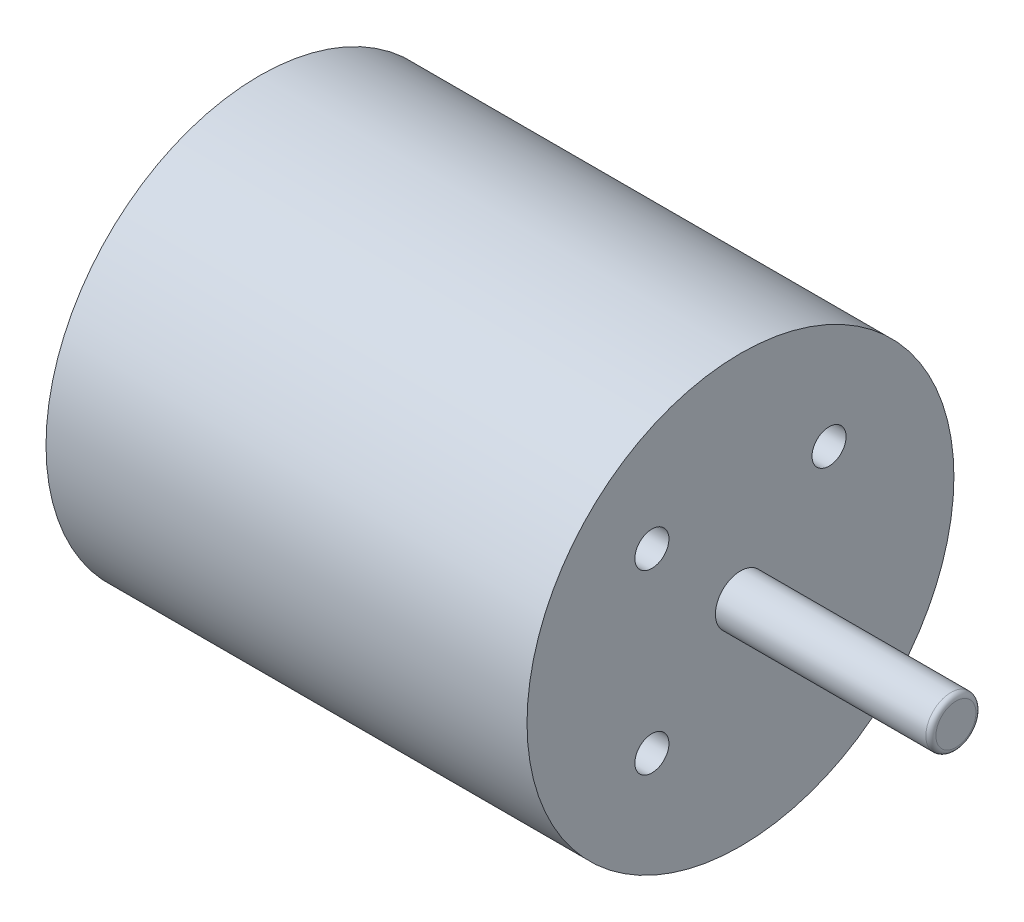
ISO-10303-21;
HEADER;
FILE_DESCRIPTION(('STEP AP214'),'2;1');
FILE_NAME('part.step','',(''),(''),'','','');
FILE_SCHEMA(('AUTOMOTIVE_DESIGN { 1 0 10303 214 1 1 1 1 }'));
ENDSEC;
DATA;
#1=APPLICATION_CONTEXT('core data for automotive mechanical design processes');
#2=APPLICATION_PROTOCOL_DEFINITION('international standard','automotive_design',2000,#1);
#3=PRODUCT_CONTEXT('',#1,'mechanical');
#4=PRODUCT('Part','Part','',(#3));
#5=PRODUCT_RELATED_PRODUCT_CATEGORY('part','',(#4));
#6=PRODUCT_DEFINITION_FORMATION('','',#4);
#7=PRODUCT_DEFINITION_CONTEXT('part definition',#1,'design');
#8=PRODUCT_DEFINITION('design','',#6,#7);
#9=PRODUCT_DEFINITION_SHAPE('','',#8);
#10=(LENGTH_UNIT() NAMED_UNIT(*) SI_UNIT(.MILLI.,.METRE.));
#11=(NAMED_UNIT(*) PLANE_ANGLE_UNIT() SI_UNIT($,.RADIAN.));
#12=(NAMED_UNIT(*) SI_UNIT($,.STERADIAN.) SOLID_ANGLE_UNIT());
#13=UNCERTAINTY_MEASURE_WITH_UNIT(LENGTH_MEASURE(1.E-05),#10,'distance_accuracy_value','');
#14=(GEOMETRIC_REPRESENTATION_CONTEXT(3) GLOBAL_UNCERTAINTY_ASSIGNED_CONTEXT((#13)) GLOBAL_UNIT_ASSIGNED_CONTEXT((#10,
#11,#12)) REPRESENTATION_CONTEXT('',''));
#15=CARTESIAN_POINT('',(0.,0.,0.));
#16=DIRECTION('',(0.,0.,1.));
#17=DIRECTION('',(1.,0.,0.));
#18=AXIS2_PLACEMENT_3D('',#15,#16,#17);
#19=CARTESIAN_POINT('',(36.5,0.,0.));
#20=DIRECTION('',(1.,0.,0.));
#21=DIRECTION('',(0.,0.,-1.));
#22=AXIS2_PLACEMENT_3D('',#19,#20,#21);
#23=CYLINDRICAL_SURFACE('',#22,2.501);
#24=CARTESIAN_POINT('',(-32.5,0.,0.));
#25=DIRECTION('',(1.,0.,0.));
#26=DIRECTION('',(0.,0.,-1.));
#27=AXIS2_PLACEMENT_3D('',#24,#25,#26);
#28=CIRCLE('',#27,2.50100000000001);
#29=CARTESIAN_POINT('',(-32.5,0.,-2.50100000000001));
#30=VERTEX_POINT('',#29);
#31=EDGE_CURVE('E12',#30,#30,#28,.T.);
#32=ORIENTED_EDGE('',*,*,#31,.F.);
#33=EDGE_LOOP('',(#32));
#34=FACE_BOUND('',#33,.T.);
#35=CARTESIAN_POINT('',(15.5,0.,0.));
#36=DIRECTION('',(1.,0.,0.));
#37=DIRECTION('',(0.,0.,-1.));
#38=AXIS2_PLACEMENT_3D('',#35,#36,#37);
#39=CIRCLE('',#38,2.501);
#40=CARTESIAN_POINT('',(15.5,0.,-2.501));
#41=VERTEX_POINT('',#40);
#42=EDGE_CURVE('E154',#41,#41,#39,.T.);
#43=ORIENTED_EDGE('',*,*,#42,.T.);
#44=EDGE_LOOP('',(#43));
#45=FACE_BOUND('',#44,.T.);
#46=ADVANCED_FACE('F48',(#34,#45),#23,.F.);
#47=CARTESIAN_POINT('',(-32.5,0.,2.50100000000001));
#48=DIRECTION('',(1.,0.,0.));
#49=DIRECTION('',(0.,0.,-1.));
#50=AXIS2_PLACEMENT_3D('',#47,#48,#49);
#51=PLANE('',#50);
#52=CARTESIAN_POINT('',(-32.5,7.07106781186543,-7.07106781186552));
#53=DIRECTION('',(-1.,0.,0.));
#54=DIRECTION('',(0.,0.,1.));
#55=AXIS2_PLACEMENT_3D('',#52,#53,#54);
#56=CIRCLE('',#55,1.7);
#57=CARTESIAN_POINT('',(-32.5,7.07106781186543,-5.37106781186552));
#58=VERTEX_POINT('',#57);
#59=EDGE_CURVE('E93',#58,#58,#56,.T.);
#60=ORIENTED_EDGE('',*,*,#59,.F.);
#61=EDGE_LOOP('',(#60));
#62=FACE_BOUND('',#61,.T.);
#63=CARTESIAN_POINT('',(-32.5,-7.07106781186543,-7.07106781186552));
#64=DIRECTION('',(-1.,0.,0.));
#65=DIRECTION('',(0.,0.,1.));
#66=AXIS2_PLACEMENT_3D('',#63,#64,#65);
#67=CIRCLE('',#66,1.7);
#68=CARTESIAN_POINT('',(-32.5,-7.07106781186543,-5.37106781186552));
#69=VERTEX_POINT('',#68);
#70=EDGE_CURVE('E92',#69,#69,#67,.T.);
#71=ORIENTED_EDGE('',*,*,#70,.F.);
#72=EDGE_LOOP('',(#71));
#73=FACE_BOUND('',#72,.T.);
#74=CARTESIAN_POINT('',(-32.5,-7.07106781186543,7.07106781186552));
#75=DIRECTION('',(-1.,0.,0.));
#76=DIRECTION('',(0.,0.,1.));
#77=AXIS2_PLACEMENT_3D('',#74,#75,#76);
#78=CIRCLE('',#77,1.7);
#79=CARTESIAN_POINT('',(-32.5,-7.07106781186543,8.77106781186552));
#80=VERTEX_POINT('',#79);
#81=EDGE_CURVE('E106',#80,#80,#78,.T.);
#82=ORIENTED_EDGE('',*,*,#81,.F.);
#83=EDGE_LOOP('',(#82));
#84=FACE_BOUND('',#83,.T.);
#85=CARTESIAN_POINT('',(-32.5,7.07106781186543,7.07106781186552));
#86=DIRECTION('',(-1.,0.,0.));
#87=DIRECTION('',(0.,0.,1.));
#88=AXIS2_PLACEMENT_3D('',#85,#86,#87);
#89=CIRCLE('',#88,1.7);
#90=CARTESIAN_POINT('',(-32.5,7.07106781186543,8.77106781186552));
#91=VERTEX_POINT('',#90);
#92=EDGE_CURVE('E114',#91,#91,#89,.T.);
#93=ORIENTED_EDGE('',*,*,#92,.F.);
#94=EDGE_LOOP('',(#93));
#95=FACE_BOUND('',#94,.T.);
#96=CARTESIAN_POINT('',(-32.5,0.,0.));
#97=DIRECTION('',(1.,0.,0.));
#98=DIRECTION('',(0.,0.,-1.));
#99=AXIS2_PLACEMENT_3D('',#96,#97,#98);
#100=CIRCLE('',#99,21.3);
#101=CARTESIAN_POINT('',(-32.5,0.,-21.3));
#102=VERTEX_POINT('',#101);
#103=EDGE_CURVE('E56',#102,#102,#100,.T.);
#104=ORIENTED_EDGE('',*,*,#103,.F.);
#105=EDGE_LOOP('',(#104));
#106=FACE_BOUND('',#105,.T.);
#107=ORIENTED_EDGE('',*,*,#31,.T.);
#108=EDGE_LOOP('',(#107));
#109=FACE_BOUND('',#108,.T.);
#110=ADVANCED_FACE('F167',(#62,#73,#84,#95,#106,#109),#51,.F.);
#111=CARTESIAN_POINT('',(36.5,0.,0.));
#112=DIRECTION('',(1.,0.,0.));
#113=DIRECTION('',(0.,0.,-1.));
#114=AXIS2_PLACEMENT_3D('',#111,#112,#113);
#115=CYLINDRICAL_SURFACE('',#114,21.3);
#116=CARTESIAN_POINT('',(15.5,0.,0.));
#117=DIRECTION('',(1.,0.,0.));
#118=DIRECTION('',(0.,0.,-1.));
#119=AXIS2_PLACEMENT_3D('',#116,#117,#118);
#120=CIRCLE('',#119,21.3);
#121=CARTESIAN_POINT('',(15.5,0.,-21.3));
#122=VERTEX_POINT('',#121);
#123=EDGE_CURVE('E158',#122,#122,#120,.T.);
#124=ORIENTED_EDGE('',*,*,#123,.F.);
#125=EDGE_LOOP('',(#124));
#126=FACE_BOUND('',#125,.T.);
#127=ORIENTED_EDGE('',*,*,#103,.T.);
#128=EDGE_LOOP('',(#127));
#129=FACE_BOUND('',#128,.T.);
#130=ADVANCED_FACE('F165',(#126,#129),#115,.T.);
#131=CARTESIAN_POINT('',(15.5,0.,21.3));
#132=DIRECTION('',(-1.,0.,0.));
#133=DIRECTION('',(0.,0.,1.));
#134=AXIS2_PLACEMENT_3D('',#131,#132,#133);
#135=PLANE('',#134);
#136=CARTESIAN_POINT('',(15.5,8.83883476483179,8.83883476483189));
#137=DIRECTION('',(1.,0.,0.));
#138=DIRECTION('',(0.,0.,-1.));
#139=AXIS2_PLACEMENT_3D('',#136,#137,#138);
#140=CIRCLE('',#139,1.7);
#141=CARTESIAN_POINT('',(15.5,8.83883476483179,7.13883476483189));
#142=VERTEX_POINT('',#141);
#143=EDGE_CURVE('E122',#142,#142,#140,.T.);
#144=ORIENTED_EDGE('',*,*,#143,.F.);
#145=EDGE_LOOP('',(#144));
#146=FACE_BOUND('',#145,.T.);
#147=CARTESIAN_POINT('',(15.5,8.83883476483179,-8.83883476483189));
#148=DIRECTION('',(1.,0.,0.));
#149=DIRECTION('',(0.,0.,-1.));
#150=AXIS2_PLACEMENT_3D('',#147,#148,#149);
#151=CIRCLE('',#150,1.7);
#152=CARTESIAN_POINT('',(15.5,8.83883476483179,-10.5388347648319));
#153=VERTEX_POINT('',#152);
#154=EDGE_CURVE('E130',#153,#153,#151,.T.);
#155=ORIENTED_EDGE('',*,*,#154,.F.);
#156=EDGE_LOOP('',(#155));
#157=FACE_BOUND('',#156,.T.);
#158=CARTESIAN_POINT('',(15.5,-8.83883476483179,-8.83883476483189));
#159=DIRECTION('',(1.,0.,0.));
#160=DIRECTION('',(0.,0.,-1.));
#161=AXIS2_PLACEMENT_3D('',#158,#159,#160);
#162=CIRCLE('',#161,1.7);
#163=CARTESIAN_POINT('',(15.5,-8.83883476483179,-10.5388347648319));
#164=VERTEX_POINT('',#163);
#165=EDGE_CURVE('E138',#164,#164,#162,.T.);
#166=ORIENTED_EDGE('',*,*,#165,.F.);
#167=EDGE_LOOP('',(#166));
#168=FACE_BOUND('',#167,.T.);
#169=CARTESIAN_POINT('',(15.5,-8.83883476483179,8.83883476483189));
#170=DIRECTION('',(1.,0.,0.));
#171=DIRECTION('',(0.,0.,-1.));
#172=AXIS2_PLACEMENT_3D('',#169,#170,#171);
#173=CIRCLE('',#172,1.7);
#174=CARTESIAN_POINT('',(15.5,-8.83883476483179,7.13883476483189));
#175=VERTEX_POINT('',#174);
#176=EDGE_CURVE('E146',#175,#175,#173,.T.);
#177=ORIENTED_EDGE('',*,*,#176,.F.);
#178=EDGE_LOOP('',(#177));
#179=FACE_BOUND('',#178,.T.);
#180=ORIENTED_EDGE('',*,*,#42,.F.);
#181=EDGE_LOOP('',(#180));
#182=FACE_BOUND('',#181,.T.);
#183=ORIENTED_EDGE('',*,*,#123,.T.);
#184=EDGE_LOOP('',(#183));
#185=FACE_BOUND('',#184,.T.);
#186=ADVANCED_FACE('F177',(#146,#157,#168,#179,#182,#185),#135,.F.);
#187=CARTESIAN_POINT('',(5.50000000000001,-8.83883476483179,8.83883476483189));
#188=DIRECTION('',(1.,0.,0.));
#189=DIRECTION('',(0.,0.,-1.));
#190=AXIS2_PLACEMENT_3D('',#187,#188,#189);
#191=CONICAL_SURFACE('',#190,1.7,1.02974425867665);
#192=CARTESIAN_POINT('',(4.47853694765315,-8.8388347648318,8.83883476483189));
#193=VERTEX_POINT('',#192);
#194=VERTEX_LOOP('',#193);
#195=FACE_BOUND('',#194,.T.);
#196=CARTESIAN_POINT('',(5.50000000000001,-8.83883476483179,8.83883476483189));
#197=DIRECTION('',(1.,0.,0.));
#198=DIRECTION('',(0.,0.,-1.));
#199=AXIS2_PLACEMENT_3D('',#196,#197,#198);
#200=CIRCLE('',#199,1.7);
#201=CARTESIAN_POINT('',(5.50000000000001,-8.83883476483179,7.13883476483189));
#202=VERTEX_POINT('',#201);
#203=EDGE_CURVE('E150',#202,#202,#200,.T.);
#204=ORIENTED_EDGE('',*,*,#203,.T.);
#205=EDGE_LOOP('',(#204));
#206=FACE_BOUND('',#205,.T.);
#207=ADVANCED_FACE('F180',(#195,#206),#191,.F.);
#208=CARTESIAN_POINT('',(15.5,-8.83883476483179,8.83883476483189));
#209=DIRECTION('',(1.,0.,0.));
#210=DIRECTION('',(0.,0.,-1.));
#211=AXIS2_PLACEMENT_3D('',#208,#209,#210);
#212=CYLINDRICAL_SURFACE('',#211,1.7);
#213=ORIENTED_EDGE('',*,*,#203,.F.);
#214=EDGE_LOOP('',(#213));
#215=FACE_BOUND('',#214,.T.);
#216=ORIENTED_EDGE('',*,*,#176,.T.);
#217=EDGE_LOOP('',(#216));
#218=FACE_BOUND('',#217,.T.);
#219=ADVANCED_FACE('F192',(#215,#218),#212,.F.);
#220=CARTESIAN_POINT('',(5.50000000000001,-8.83883476483179,-8.83883476483189));
#221=DIRECTION('',(1.,0.,0.));
#222=DIRECTION('',(0.,0.,-1.));
#223=AXIS2_PLACEMENT_3D('',#220,#221,#222);
#224=CONICAL_SURFACE('',#223,1.7,1.02974425867665);
#225=CARTESIAN_POINT('',(4.47853694765315,-8.8388347648318,-8.83883476483189));
#226=VERTEX_POINT('',#225);
#227=VERTEX_LOOP('',#226);
#228=FACE_BOUND('',#227,.T.);
#229=CARTESIAN_POINT('',(5.50000000000001,-8.83883476483179,-8.83883476483189));
#230=DIRECTION('',(1.,0.,0.));
#231=DIRECTION('',(0.,0.,-1.));
#232=AXIS2_PLACEMENT_3D('',#229,#230,#231);
#233=CIRCLE('',#232,1.7);
#234=CARTESIAN_POINT('',(5.50000000000001,-8.83883476483179,-10.5388347648319));
#235=VERTEX_POINT('',#234);
#236=EDGE_CURVE('E142',#235,#235,#233,.T.);
#237=ORIENTED_EDGE('',*,*,#236,.T.);
#238=EDGE_LOOP('',(#237));
#239=FACE_BOUND('',#238,.T.);
#240=ADVANCED_FACE('F195',(#228,#239),#224,.F.);
#241=CARTESIAN_POINT('',(15.5,-8.83883476483179,-8.83883476483189));
#242=DIRECTION('',(1.,0.,0.));
#243=DIRECTION('',(0.,0.,-1.));
#244=AXIS2_PLACEMENT_3D('',#241,#242,#243);
#245=CYLINDRICAL_SURFACE('',#244,1.7);
#246=ORIENTED_EDGE('',*,*,#236,.F.);
#247=EDGE_LOOP('',(#246));
#248=FACE_BOUND('',#247,.T.);
#249=ORIENTED_EDGE('',*,*,#165,.T.);
#250=EDGE_LOOP('',(#249));
#251=FACE_BOUND('',#250,.T.);
#252=ADVANCED_FACE('F199',(#248,#251),#245,.F.);
#253=CARTESIAN_POINT('',(5.50000000000001,8.83883476483179,-8.83883476483189));
#254=DIRECTION('',(1.,0.,0.));
#255=DIRECTION('',(0.,0.,-1.));
#256=AXIS2_PLACEMENT_3D('',#253,#254,#255);
#257=CONICAL_SURFACE('',#256,1.7,1.02974425867665);
#258=CARTESIAN_POINT('',(4.47853694765315,8.83883476483179,-8.83883476483189));
#259=VERTEX_POINT('',#258);
#260=VERTEX_LOOP('',#259);
#261=FACE_BOUND('',#260,.T.);
#262=CARTESIAN_POINT('',(5.50000000000001,8.83883476483179,-8.83883476483189));
#263=DIRECTION('',(1.,0.,0.));
#264=DIRECTION('',(0.,0.,-1.));
#265=AXIS2_PLACEMENT_3D('',#262,#263,#264);
#266=CIRCLE('',#265,1.7);
#267=CARTESIAN_POINT('',(5.50000000000001,8.83883476483179,-10.5388347648319));
#268=VERTEX_POINT('',#267);
#269=EDGE_CURVE('E134',#268,#268,#266,.T.);
#270=ORIENTED_EDGE('',*,*,#269,.T.);
#271=EDGE_LOOP('',(#270));
#272=FACE_BOUND('',#271,.T.);
#273=ADVANCED_FACE('F202',(#261,#272),#257,.F.);
#274=CARTESIAN_POINT('',(15.5,8.83883476483179,-8.83883476483189));
#275=DIRECTION('',(1.,0.,0.));
#276=DIRECTION('',(0.,0.,-1.));
#277=AXIS2_PLACEMENT_3D('',#274,#275,#276);
#278=CYLINDRICAL_SURFACE('',#277,1.7);
#279=ORIENTED_EDGE('',*,*,#269,.F.);
#280=EDGE_LOOP('',(#279));
#281=FACE_BOUND('',#280,.T.);
#282=ORIENTED_EDGE('',*,*,#154,.T.);
#283=EDGE_LOOP('',(#282));
#284=FACE_BOUND('',#283,.T.);
#285=ADVANCED_FACE('F206',(#281,#284),#278,.F.);
#286=CARTESIAN_POINT('',(5.50000000000001,8.83883476483179,8.83883476483189));
#287=DIRECTION('',(1.,0.,0.));
#288=DIRECTION('',(0.,0.,-1.));
#289=AXIS2_PLACEMENT_3D('',#286,#287,#288);
#290=CONICAL_SURFACE('',#289,1.7,1.02974425867665);
#291=CARTESIAN_POINT('',(4.47853694765315,8.83883476483179,8.83883476483189));
#292=VERTEX_POINT('',#291);
#293=VERTEX_LOOP('',#292);
#294=FACE_BOUND('',#293,.T.);
#295=CARTESIAN_POINT('',(5.50000000000001,8.83883476483179,8.83883476483189));
#296=DIRECTION('',(1.,0.,0.));
#297=DIRECTION('',(0.,0.,-1.));
#298=AXIS2_PLACEMENT_3D('',#295,#296,#297);
#299=CIRCLE('',#298,1.7);
#300=CARTESIAN_POINT('',(5.50000000000001,8.83883476483179,7.1388347648319));
#301=VERTEX_POINT('',#300);
#302=EDGE_CURVE('E126',#301,#301,#299,.T.);
#303=ORIENTED_EDGE('',*,*,#302,.T.);
#304=EDGE_LOOP('',(#303));
#305=FACE_BOUND('',#304,.T.);
#306=ADVANCED_FACE('F210',(#294,#305),#290,.F.);
#307=CARTESIAN_POINT('',(15.5,8.83883476483179,8.83883476483189));
#308=DIRECTION('',(1.,0.,0.));
#309=DIRECTION('',(0.,0.,-1.));
#310=AXIS2_PLACEMENT_3D('',#307,#308,#309);
#311=CYLINDRICAL_SURFACE('',#310,1.7);
#312=ORIENTED_EDGE('',*,*,#302,.F.);
#313=EDGE_LOOP('',(#312));
#314=FACE_BOUND('',#313,.T.);
#315=ORIENTED_EDGE('',*,*,#143,.T.);
#316=EDGE_LOOP('',(#315));
#317=FACE_BOUND('',#316,.T.);
#318=ADVANCED_FACE('F214',(#314,#317),#311,.F.);
#319=CARTESIAN_POINT('',(-22.5,7.07106781186543,7.07106781186552));
#320=DIRECTION('',(-1.,0.,0.));
#321=DIRECTION('',(0.,0.,1.));
#322=AXIS2_PLACEMENT_3D('',#319,#320,#321);
#323=CONICAL_SURFACE('',#322,1.7,1.02974425867665);
#324=CARTESIAN_POINT('',(-21.4785369476532,7.07106781186543,7.07106781186552));
#325=VERTEX_POINT('',#324);
#326=VERTEX_LOOP('',#325);
#327=FACE_BOUND('',#326,.T.);
#328=CARTESIAN_POINT('',(-22.5,7.07106781186543,7.07106781186552));
#329=DIRECTION('',(-1.,0.,0.));
#330=DIRECTION('',(0.,0.,1.));
#331=AXIS2_PLACEMENT_3D('',#328,#329,#330);
#332=CIRCLE('',#331,1.7);
#333=CARTESIAN_POINT('',(-22.5,7.07106781186543,8.77106781186551));
#334=VERTEX_POINT('',#333);
#335=EDGE_CURVE('E118',#334,#334,#332,.T.);
#336=ORIENTED_EDGE('',*,*,#335,.T.);
#337=EDGE_LOOP('',(#336));
#338=FACE_BOUND('',#337,.T.);
#339=ADVANCED_FACE('F218',(#327,#338),#323,.F.);
#340=CARTESIAN_POINT('',(-32.5,7.07106781186543,7.07106781186552));
#341=DIRECTION('',(-1.,0.,0.));
#342=DIRECTION('',(0.,0.,1.));
#343=AXIS2_PLACEMENT_3D('',#340,#341,#342);
#344=CYLINDRICAL_SURFACE('',#343,1.7);
#345=ORIENTED_EDGE('',*,*,#335,.F.);
#346=EDGE_LOOP('',(#345));
#347=FACE_BOUND('',#346,.T.);
#348=ORIENTED_EDGE('',*,*,#92,.T.);
#349=EDGE_LOOP('',(#348));
#350=FACE_BOUND('',#349,.T.);
#351=ADVANCED_FACE('F222',(#347,#350),#344,.F.);
#352=CARTESIAN_POINT('',(-22.5,-7.07106781186543,7.07106781186552));
#353=DIRECTION('',(-1.,0.,0.));
#354=DIRECTION('',(0.,0.,1.));
#355=AXIS2_PLACEMENT_3D('',#352,#353,#354);
#356=CONICAL_SURFACE('',#355,1.7,1.02974425867665);
#357=CARTESIAN_POINT('',(-21.4785369476532,-7.07106781186543,7.07106781186552));
#358=VERTEX_POINT('',#357);
#359=VERTEX_LOOP('',#358);
#360=FACE_BOUND('',#359,.T.);
#361=CARTESIAN_POINT('',(-22.5,-7.07106781186543,7.07106781186552));
#362=DIRECTION('',(-1.,0.,0.));
#363=DIRECTION('',(0.,0.,1.));
#364=AXIS2_PLACEMENT_3D('',#361,#362,#363);
#365=CIRCLE('',#364,1.7);
#366=CARTESIAN_POINT('',(-22.5,-7.07106781186543,8.77106781186551));
#367=VERTEX_POINT('',#366);
#368=EDGE_CURVE('E110',#367,#367,#365,.T.);
#369=ORIENTED_EDGE('',*,*,#368,.T.);
#370=EDGE_LOOP('',(#369));
#371=FACE_BOUND('',#370,.T.);
#372=ADVANCED_FACE('F226',(#360,#371),#356,.F.);
#373=CARTESIAN_POINT('',(-32.5,-7.07106781186543,7.07106781186552));
#374=DIRECTION('',(-1.,0.,0.));
#375=DIRECTION('',(0.,0.,1.));
#376=AXIS2_PLACEMENT_3D('',#373,#374,#375);
#377=CYLINDRICAL_SURFACE('',#376,1.7);
#378=ORIENTED_EDGE('',*,*,#368,.F.);
#379=EDGE_LOOP('',(#378));
#380=FACE_BOUND('',#379,.T.);
#381=ORIENTED_EDGE('',*,*,#81,.T.);
#382=EDGE_LOOP('',(#381));
#383=FACE_BOUND('',#382,.T.);
#384=ADVANCED_FACE('F230',(#380,#383),#377,.F.);
#385=CARTESIAN_POINT('',(-22.5,-7.07106781186543,-7.07106781186552));
#386=DIRECTION('',(-1.,0.,0.));
#387=DIRECTION('',(0.,0.,1.));
#388=AXIS2_PLACEMENT_3D('',#385,#386,#387);
#389=CONICAL_SURFACE('',#388,1.7,1.02974425867665);
#390=CARTESIAN_POINT('',(-21.4785369476532,-7.07106781186543,-7.07106781186552));
#391=VERTEX_POINT('',#390);
#392=VERTEX_LOOP('',#391);
#393=FACE_BOUND('',#392,.T.);
#394=CARTESIAN_POINT('',(-22.5,-7.07106781186543,-7.07106781186552));
#395=DIRECTION('',(-1.,0.,0.));
#396=DIRECTION('',(0.,0.,1.));
#397=AXIS2_PLACEMENT_3D('',#394,#395,#396);
#398=CIRCLE('',#397,1.7);
#399=CARTESIAN_POINT('',(-22.5,-7.07106781186543,-5.37106781186552));
#400=VERTEX_POINT('',#399);
#401=EDGE_CURVE('E98',#400,#400,#398,.T.);
#402=ORIENTED_EDGE('',*,*,#401,.T.);
#403=EDGE_LOOP('',(#402));
#404=FACE_BOUND('',#403,.T.);
#405=ADVANCED_FACE('F234',(#393,#404),#389,.F.);
#406=CARTESIAN_POINT('',(-32.5,-7.07106781186543,-7.07106781186552));
#407=DIRECTION('',(-1.,0.,0.));
#408=DIRECTION('',(0.,0.,1.));
#409=AXIS2_PLACEMENT_3D('',#406,#407,#408);
#410=CYLINDRICAL_SURFACE('',#409,1.7);
#411=ORIENTED_EDGE('',*,*,#401,.F.);
#412=EDGE_LOOP('',(#411));
#413=FACE_BOUND('',#412,.T.);
#414=ORIENTED_EDGE('',*,*,#70,.T.);
#415=EDGE_LOOP('',(#414));
#416=FACE_BOUND('',#415,.T.);
#417=ADVANCED_FACE('F85',(#413,#416),#410,.F.);
#418=CARTESIAN_POINT('',(-22.5,7.07106781186543,-7.07106781186552));
#419=DIRECTION('',(-1.,0.,0.));
#420=DIRECTION('',(0.,0.,1.));
#421=AXIS2_PLACEMENT_3D('',#418,#419,#420);
#422=CONICAL_SURFACE('',#421,1.7,1.02974425867665);
#423=CARTESIAN_POINT('',(-21.4785369476532,7.07106781186543,-7.07106781186552));
#424=VERTEX_POINT('',#423);
#425=VERTEX_LOOP('',#424);
#426=FACE_BOUND('',#425,.T.);
#427=CARTESIAN_POINT('',(-22.5,7.07106781186543,-7.07106781186552));
#428=DIRECTION('',(-1.,0.,0.));
#429=DIRECTION('',(0.,0.,1.));
#430=AXIS2_PLACEMENT_3D('',#427,#428,#429);
#431=CIRCLE('',#430,1.7);
#432=CARTESIAN_POINT('',(-22.5,7.07106781186543,-5.37106781186552));
#433=VERTEX_POINT('',#432);
#434=EDGE_CURVE('E89',#433,#433,#431,.T.);
#435=ORIENTED_EDGE('',*,*,#434,.T.);
#436=EDGE_LOOP('',(#435));
#437=FACE_BOUND('',#436,.T.);
#438=ADVANCED_FACE('F81',(#426,#437),#422,.F.);
#439=CARTESIAN_POINT('',(-32.5,7.07106781186543,-7.07106781186552));
#440=DIRECTION('',(-1.,0.,0.));
#441=DIRECTION('',(0.,0.,1.));
#442=AXIS2_PLACEMENT_3D('',#439,#440,#441);
#443=CYLINDRICAL_SURFACE('',#442,1.7);
#444=ORIENTED_EDGE('',*,*,#434,.F.);
#445=EDGE_LOOP('',(#444));
#446=FACE_BOUND('',#445,.T.);
#447=ORIENTED_EDGE('',*,*,#59,.T.);
#448=EDGE_LOOP('',(#447));
#449=FACE_BOUND('',#448,.T.);
#450=ADVANCED_FACE('F84',(#446,#449),#443,.F.);
#451=CLOSED_SHELL('',(#46,#110,#130,#186,#207,#219,#240,#252,#273,#285,#306,#318,#339,#351,#372,
#384,#405,#417,#438,#450));
#452=MANIFOLD_SOLID_BREP('B2',#451);
#453=CARTESIAN_POINT('',(-32.5,0.,0.));
#454=DIRECTION('',(1.,0.,0.));
#455=DIRECTION('',(0.,0.,-1.));
#456=AXIS2_PLACEMENT_3D('',#453,#454,#455);
#457=PLANE('',#456);
#458=CARTESIAN_POINT('',(-32.5,0.,0.));
#459=DIRECTION('',(-1.,0.,0.));
#460=DIRECTION('',(0.,0.,1.));
#461=AXIS2_PLACEMENT_3D('',#458,#459,#460);
#462=CIRCLE('',#461,2.5);
#463=CARTESIAN_POINT('',(-32.5,0.,2.5));
#464=VERTEX_POINT('',#463);
#465=EDGE_CURVE('E410',#464,#464,#462,.T.);
#466=ORIENTED_EDGE('',*,*,#465,.T.);
#467=EDGE_LOOP('',(#466));
#468=FACE_BOUND('',#467,.T.);
#469=ADVANCED_FACE('F399',(#468),#457,.F.);
#470=CARTESIAN_POINT('',(-36.8401099431075,0.,0.));
#471=DIRECTION('',(-1.,0.,0.));
#472=DIRECTION('',(0.,0.,1.));
#473=AXIS2_PLACEMENT_3D('',#470,#471,#472);
#474=CYLINDRICAL_SURFACE('',#473,2.5);
#475=CARTESIAN_POINT('',(36.5,0.,0.));
#476=DIRECTION('',(-1.,0.,0.));
#477=DIRECTION('',(0.,0.,1.));
#478=AXIS2_PLACEMENT_3D('',#475,#476,#477);
#479=CIRCLE('',#478,2.5);
#480=CARTESIAN_POINT('',(36.5,0.,2.5));
#481=VERTEX_POINT('',#480);
#482=EDGE_CURVE('E406',#481,#481,#479,.T.);
#483=ORIENTED_EDGE('',*,*,#482,.T.);
#484=EDGE_LOOP('',(#483));
#485=FACE_BOUND('',#484,.T.);
#486=ORIENTED_EDGE('',*,*,#465,.F.);
#487=EDGE_LOOP('',(#486));
#488=FACE_BOUND('',#487,.T.);
#489=ADVANCED_FACE('F418',(#485,#488),#474,.T.);
#490=CARTESIAN_POINT('',(37.,2.5,0.));
#491=DIRECTION('',(-1.,0.,0.));
#492=DIRECTION('',(0.,0.,1.));
#493=AXIS2_PLACEMENT_3D('',#490,#491,#492);
#494=PLANE('',#493);
#495=CARTESIAN_POINT('',(37.,0.,0.));
#496=DIRECTION('',(-1.,0.,0.));
#497=DIRECTION('',(0.,0.,1.));
#498=AXIS2_PLACEMENT_3D('',#495,#496,#497);
#499=CIRCLE('',#498,2.);
#500=CARTESIAN_POINT('',(37.,0.,2.));
#501=VERTEX_POINT('',#500);
#502=EDGE_CURVE('E47',#501,#501,#499,.F.);
#503=ORIENTED_EDGE('',*,*,#502,.T.);
#504=EDGE_LOOP('',(#503));
#505=FACE_BOUND('',#504,.T.);
#506=ADVANCED_FACE('F420',(#505),#494,.F.);
#507=CARTESIAN_POINT('',(36.5,0.,0.));
#508=DIRECTION('',(-1.,0.,0.));
#509=DIRECTION('',(0.,0.,1.));
#510=AXIS2_PLACEMENT_3D('',#507,#508,#509);
#511=TOROIDAL_SURFACE('',#510,2.,0.5);
#512=ORIENTED_EDGE('',*,*,#502,.F.);
#513=EDGE_LOOP('',(#512));
#514=FACE_BOUND('',#513,.T.);
#515=ORIENTED_EDGE('',*,*,#482,.F.);
#516=EDGE_LOOP('',(#515));
#517=FACE_BOUND('',#516,.T.);
#518=ADVANCED_FACE('F401',(#514,#517),#511,.T.);
#519=CLOSED_SHELL('',(#469,#489,#506,#518));
#520=MANIFOLD_SOLID_BREP('B6',#519);
#521=ADVANCED_BREP_SHAPE_REPRESENTATION('',(#18,#452,#520),#14);
#522=SHAPE_DEFINITION_REPRESENTATION(#9,#521);
ENDSEC;
END-ISO-10303-21;
